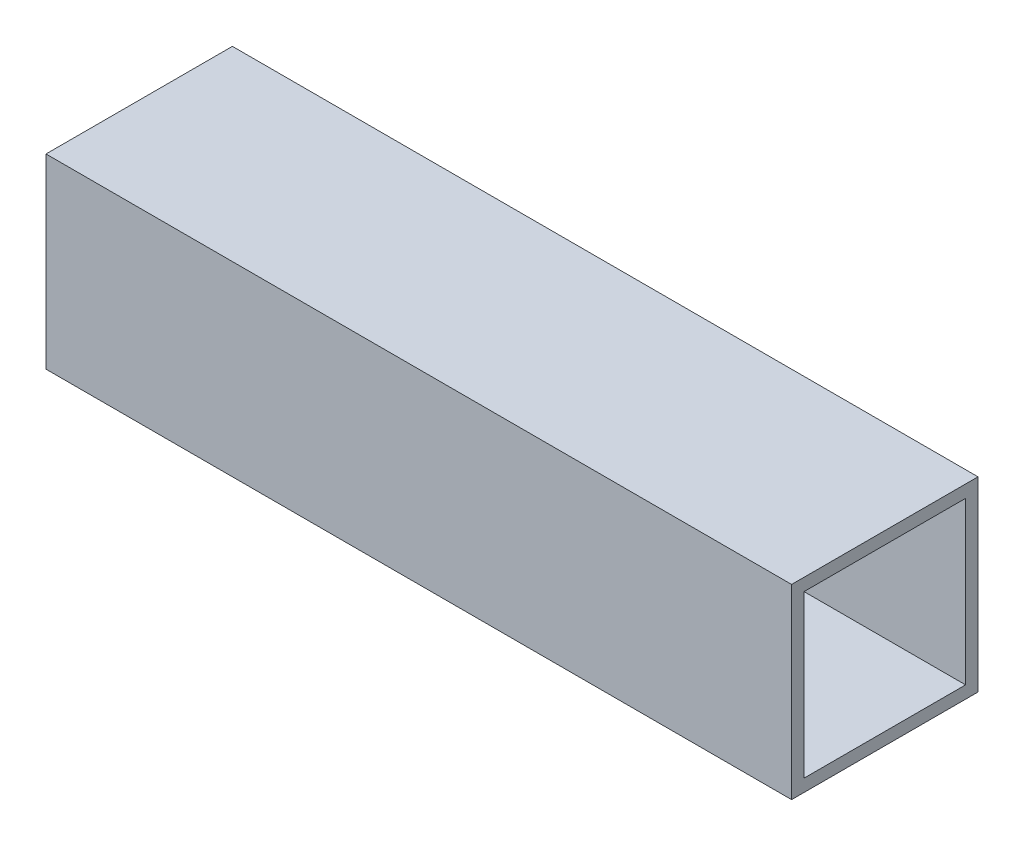
ISO-10303-21;
HEADER;
FILE_DESCRIPTION(('STEP AP214'),'2;1');
FILE_NAME('part.step','',(''),(''),'','','');
FILE_SCHEMA(('AUTOMOTIVE_DESIGN { 1 0 10303 214 1 1 1 1 }'));
ENDSEC;
DATA;
#1=APPLICATION_CONTEXT('core data for automotive mechanical design processes');
#2=APPLICATION_PROTOCOL_DEFINITION('international standard','automotive_design',2000,#1);
#3=PRODUCT_CONTEXT('',#1,'mechanical');
#4=PRODUCT('Part','Part','',(#3));
#5=PRODUCT_RELATED_PRODUCT_CATEGORY('part','',(#4));
#6=PRODUCT_DEFINITION_FORMATION('','',#4);
#7=PRODUCT_DEFINITION_CONTEXT('part definition',#1,'design');
#8=PRODUCT_DEFINITION('design','',#6,#7);
#9=PRODUCT_DEFINITION_SHAPE('','',#8);
#10=(LENGTH_UNIT() NAMED_UNIT(*) SI_UNIT(.MILLI.,.METRE.));
#11=(NAMED_UNIT(*) PLANE_ANGLE_UNIT() SI_UNIT($,.RADIAN.));
#12=(NAMED_UNIT(*) SI_UNIT($,.STERADIAN.) SOLID_ANGLE_UNIT());
#13=UNCERTAINTY_MEASURE_WITH_UNIT(LENGTH_MEASURE(1.E-05),#10,'distance_accuracy_value','');
#14=(GEOMETRIC_REPRESENTATION_CONTEXT(3) GLOBAL_UNCERTAINTY_ASSIGNED_CONTEXT((#13)) GLOBAL_UNIT_ASSIGNED_CONTEXT((#10,
#11,#12)) REPRESENTATION_CONTEXT('',''));
#15=CARTESIAN_POINT('',(0.,0.,0.));
#16=DIRECTION('',(0.,0.,1.));
#17=DIRECTION('',(1.,0.,0.));
#18=AXIS2_PLACEMENT_3D('',#15,#16,#17);
#19=CARTESIAN_POINT('',(-60.,-6.49999999999999,-6.50000000000001));
#20=DIRECTION('',(0.,1.,0.));
#21=DIRECTION('',(0.,0.,1.));
#22=AXIS2_PLACEMENT_3D('',#19,#20,#21);
#23=PLANE('',#22);
#24=DIRECTION('',(0.,0.,1.));
#25=VECTOR('',#24,1.);
#26=CARTESIAN_POINT('',(0.,-6.49999999999999,-6.50000000000001));
#27=LINE('',#26,#25);
#28=CARTESIAN_POINT('',(0.,-6.49999999999999,-6.50000000000001));
#29=VERTEX_POINT('',#28);
#30=CARTESIAN_POINT('',(0.,-6.49999999999999,6.49999999999999));
#31=VERTEX_POINT('',#30);
#32=EDGE_CURVE('E157',#29,#31,#27,.T.);
#33=ORIENTED_EDGE('',*,*,#32,.F.);
#34=DIRECTION('',(1.,0.,0.));
#35=VECTOR('',#34,1.);
#36=CARTESIAN_POINT('',(-60.,-6.49999999999999,-6.50000000000001));
#37=LINE('',#36,#35);
#38=CARTESIAN_POINT('',(-60.,-6.49999999999999,-6.50000000000001));
#39=VERTEX_POINT('',#38);
#40=EDGE_CURVE('E12',#39,#29,#37,.T.);
#41=ORIENTED_EDGE('',*,*,#40,.F.);
#42=DIRECTION('',(0.,0.,1.));
#43=VECTOR('',#42,1.);
#44=CARTESIAN_POINT('',(-60.,-6.49999999999999,-6.50000000000001));
#45=LINE('',#44,#43);
#46=CARTESIAN_POINT('',(-60.,-6.49999999999999,6.49999999999999));
#47=VERTEX_POINT('',#46);
#48=EDGE_CURVE('E139',#39,#47,#45,.T.);
#49=ORIENTED_EDGE('',*,*,#48,.T.);
#50=DIRECTION('',(1.,0.,0.));
#51=VECTOR('',#50,1.);
#52=CARTESIAN_POINT('',(-60.,-6.49999999999999,6.49999999999999));
#53=LINE('',#52,#51);
#54=EDGE_CURVE('E70',#47,#31,#53,.T.);
#55=ORIENTED_EDGE('',*,*,#54,.T.);
#56=EDGE_LOOP('',(#33,#41,#49,#55));
#57=FACE_BOUND('',#56,.T.);
#58=ADVANCED_FACE('F51',(#57),#23,.T.);
#59=CARTESIAN_POINT('',(-60.,6.50000000000001,-6.50000000000001));
#60=DIRECTION('',(0.,0.,1.));
#61=DIRECTION('',(1.,0.,0.));
#62=AXIS2_PLACEMENT_3D('',#59,#60,#61);
#63=PLANE('',#62);
#64=DIRECTION('',(0.,-1.,0.));
#65=VECTOR('',#64,1.);
#66=CARTESIAN_POINT('',(0.,6.50000000000001,-6.50000000000001));
#67=LINE('',#66,#65);
#68=CARTESIAN_POINT('',(0.,6.50000000000001,-6.50000000000001));
#69=VERTEX_POINT('',#68);
#70=EDGE_CURVE('E128',#69,#29,#67,.T.);
#71=ORIENTED_EDGE('',*,*,#70,.F.);
#72=DIRECTION('',(1.,0.,0.));
#73=VECTOR('',#72,1.);
#74=CARTESIAN_POINT('',(-60.,6.50000000000001,-6.50000000000001));
#75=LINE('',#74,#73);
#76=CARTESIAN_POINT('',(-60.,6.50000000000001,-6.50000000000001));
#77=VERTEX_POINT('',#76);
#78=EDGE_CURVE('E61',#77,#69,#75,.T.);
#79=ORIENTED_EDGE('',*,*,#78,.F.);
#80=DIRECTION('',(0.,-1.,0.));
#81=VECTOR('',#80,1.);
#82=CARTESIAN_POINT('',(-60.,6.50000000000001,-6.50000000000001));
#83=LINE('',#82,#81);
#84=EDGE_CURVE('E126',#77,#39,#83,.T.);
#85=ORIENTED_EDGE('',*,*,#84,.T.);
#86=ORIENTED_EDGE('',*,*,#40,.T.);
#87=EDGE_LOOP('',(#71,#79,#85,#86));
#88=FACE_BOUND('',#87,.T.);
#89=ADVANCED_FACE('F125',(#88),#63,.T.);
#90=CARTESIAN_POINT('',(-60.,6.50000000000001,-6.50000000000001));
#91=DIRECTION('',(0.,-1.,0.));
#92=DIRECTION('',(0.,0.,-1.));
#93=AXIS2_PLACEMENT_3D('',#90,#91,#92);
#94=PLANE('',#93);
#95=DIRECTION('',(0.,0.,-1.));
#96=VECTOR('',#95,1.);
#97=CARTESIAN_POINT('',(0.,6.50000000000001,-6.50000000000001));
#98=LINE('',#97,#96);
#99=CARTESIAN_POINT('',(0.,6.50000000000001,6.49999999999999));
#100=VERTEX_POINT('',#99);
#101=EDGE_CURVE('E160',#100,#69,#98,.T.);
#102=ORIENTED_EDGE('',*,*,#101,.F.);
#103=DIRECTION('',(1.,0.,0.));
#104=VECTOR('',#103,1.);
#105=CARTESIAN_POINT('',(-60.,6.50000000000001,6.49999999999999));
#106=LINE('',#105,#104);
#107=CARTESIAN_POINT('',(-60.,6.50000000000001,6.49999999999999));
#108=VERTEX_POINT('',#107);
#109=EDGE_CURVE('E95',#108,#100,#106,.T.);
#110=ORIENTED_EDGE('',*,*,#109,.F.);
#111=DIRECTION('',(0.,0.,-1.));
#112=VECTOR('',#111,1.);
#113=CARTESIAN_POINT('',(-60.,6.50000000000001,-6.50000000000001));
#114=LINE('',#113,#112);
#115=EDGE_CURVE('E138',#108,#77,#114,.T.);
#116=ORIENTED_EDGE('',*,*,#115,.T.);
#117=ORIENTED_EDGE('',*,*,#78,.T.);
#118=EDGE_LOOP('',(#102,#110,#116,#117));
#119=FACE_BOUND('',#118,.T.);
#120=ADVANCED_FACE('F141',(#119),#94,.T.);
#121=CARTESIAN_POINT('',(-60.,-7.49999999999999,-7.50000000000001));
#122=DIRECTION('',(0.,1.,0.));
#123=DIRECTION('',(0.,0.,1.));
#124=AXIS2_PLACEMENT_3D('',#121,#122,#123);
#125=PLANE('',#124);
#126=DIRECTION('',(0.,0.,1.));
#127=VECTOR('',#126,1.);
#128=CARTESIAN_POINT('',(0.,-7.49999999999999,-7.50000000000001));
#129=LINE('',#128,#127);
#130=CARTESIAN_POINT('',(0.,-7.49999999999999,-7.50000000000001));
#131=VERTEX_POINT('',#130);
#132=CARTESIAN_POINT('',(0.,-7.49999999999999,7.49999999999999));
#133=VERTEX_POINT('',#132);
#134=EDGE_CURVE('E148',#131,#133,#129,.T.);
#135=ORIENTED_EDGE('',*,*,#134,.T.);
#136=DIRECTION('',(1.,0.,0.));
#137=VECTOR('',#136,1.);
#138=CARTESIAN_POINT('',(-60.,-7.49999999999999,7.49999999999999));
#139=LINE('',#138,#137);
#140=CARTESIAN_POINT('',(-60.,-7.49999999999999,7.49999999999999));
#141=VERTEX_POINT('',#140);
#142=EDGE_CURVE('E55',#141,#133,#139,.T.);
#143=ORIENTED_EDGE('',*,*,#142,.F.);
#144=DIRECTION('',(0.,0.,1.));
#145=VECTOR('',#144,1.);
#146=CARTESIAN_POINT('',(-60.,-7.49999999999999,-7.50000000000001));
#147=LINE('',#146,#145);
#148=CARTESIAN_POINT('',(-60.,-7.49999999999999,-7.50000000000001));
#149=VERTEX_POINT('',#148);
#150=EDGE_CURVE('E165',#149,#141,#147,.T.);
#151=ORIENTED_EDGE('',*,*,#150,.F.);
#152=DIRECTION('',(1.,0.,0.));
#153=VECTOR('',#152,1.);
#154=CARTESIAN_POINT('',(-60.,-7.49999999999999,-7.50000000000001));
#155=LINE('',#154,#153);
#156=EDGE_CURVE('E144',#149,#131,#155,.T.);
#157=ORIENTED_EDGE('',*,*,#156,.T.);
#158=EDGE_LOOP('',(#135,#143,#151,#157));
#159=FACE_BOUND('',#158,.T.);
#160=ADVANCED_FACE('F53',(#159),#125,.F.);
#161=CARTESIAN_POINT('',(-60.,7.50000000000001,7.49999999999999));
#162=DIRECTION('',(0.,0.,-1.));
#163=DIRECTION('',(-1.,0.,0.));
#164=AXIS2_PLACEMENT_3D('',#161,#162,#163);
#165=PLANE('',#164);
#166=DIRECTION('',(0.,1.,0.));
#167=VECTOR('',#166,1.);
#168=CARTESIAN_POINT('',(0.,7.50000000000001,7.49999999999999));
#169=LINE('',#168,#167);
#170=CARTESIAN_POINT('',(0.,7.50000000000001,7.49999999999999));
#171=VERTEX_POINT('',#170);
#172=EDGE_CURVE('E151',#133,#171,#169,.T.);
#173=ORIENTED_EDGE('',*,*,#172,.T.);
#174=DIRECTION('',(1.,0.,0.));
#175=VECTOR('',#174,1.);
#176=CARTESIAN_POINT('',(-60.,7.50000000000001,7.49999999999999));
#177=LINE('',#176,#175);
#178=CARTESIAN_POINT('',(-60.,7.50000000000001,7.49999999999999));
#179=VERTEX_POINT('',#178);
#180=EDGE_CURVE('E172',#179,#171,#177,.T.);
#181=ORIENTED_EDGE('',*,*,#180,.F.);
#182=DIRECTION('',(0.,1.,0.));
#183=VECTOR('',#182,1.);
#184=CARTESIAN_POINT('',(-60.,7.50000000000001,7.49999999999999));
#185=LINE('',#184,#183);
#186=EDGE_CURVE('E108',#141,#179,#185,.T.);
#187=ORIENTED_EDGE('',*,*,#186,.F.);
#188=ORIENTED_EDGE('',*,*,#142,.T.);
#189=EDGE_LOOP('',(#173,#181,#187,#188));
#190=FACE_BOUND('',#189,.T.);
#191=ADVANCED_FACE('F178',(#190),#165,.F.);
#192=CARTESIAN_POINT('',(-60.,7.49999999999999,-7.50000000000001));
#193=DIRECTION('',(0.,-1.,0.));
#194=DIRECTION('',(0.,0.,-1.));
#195=AXIS2_PLACEMENT_3D('',#192,#193,#194);
#196=PLANE('',#195);
#197=DIRECTION('',(0.,0.,-1.));
#198=VECTOR('',#197,1.);
#199=CARTESIAN_POINT('',(0.,7.49999999999999,-7.50000000000001));
#200=LINE('',#199,#198);
#201=CARTESIAN_POINT('',(0.,7.49999999999999,-7.50000000000001));
#202=VERTEX_POINT('',#201);
#203=EDGE_CURVE('E153',#171,#202,#200,.T.);
#204=ORIENTED_EDGE('',*,*,#203,.T.);
#205=DIRECTION('',(1.,0.,0.));
#206=VECTOR('',#205,1.);
#207=CARTESIAN_POINT('',(-60.,7.49999999999999,-7.50000000000001));
#208=LINE('',#207,#206);
#209=CARTESIAN_POINT('',(-60.,7.49999999999999,-7.50000000000001));
#210=VERTEX_POINT('',#209);
#211=EDGE_CURVE('E170',#210,#202,#208,.T.);
#212=ORIENTED_EDGE('',*,*,#211,.F.);
#213=DIRECTION('',(0.,0.,-1.));
#214=VECTOR('',#213,1.);
#215=CARTESIAN_POINT('',(-60.,7.49999999999999,-7.50000000000001));
#216=LINE('',#215,#214);
#217=EDGE_CURVE('E194',#179,#210,#216,.T.);
#218=ORIENTED_EDGE('',*,*,#217,.F.);
#219=ORIENTED_EDGE('',*,*,#180,.T.);
#220=EDGE_LOOP('',(#204,#212,#218,#219));
#221=FACE_BOUND('',#220,.T.);
#222=ADVANCED_FACE('F188',(#221),#196,.F.);
#223=CARTESIAN_POINT('',(-60.,7.49999999999999,-7.50000000000001));
#224=DIRECTION('',(0.,0.,1.));
#225=DIRECTION('',(1.,0.,0.));
#226=AXIS2_PLACEMENT_3D('',#223,#224,#225);
#227=PLANE('',#226);
#228=DIRECTION('',(0.,-1.,0.));
#229=VECTOR('',#228,1.);
#230=CARTESIAN_POINT('',(0.,7.49999999999999,-7.50000000000001));
#231=LINE('',#230,#229);
#232=EDGE_CURVE('E155',#202,#131,#231,.T.);
#233=ORIENTED_EDGE('',*,*,#232,.T.);
#234=ORIENTED_EDGE('',*,*,#156,.F.);
#235=DIRECTION('',(0.,-1.,0.));
#236=VECTOR('',#235,1.);
#237=CARTESIAN_POINT('',(-60.,7.49999999999999,-7.50000000000001));
#238=LINE('',#237,#236);
#239=EDGE_CURVE('E192',#210,#149,#238,.T.);
#240=ORIENTED_EDGE('',*,*,#239,.F.);
#241=ORIENTED_EDGE('',*,*,#211,.T.);
#242=EDGE_LOOP('',(#233,#234,#240,#241));
#243=FACE_BOUND('',#242,.T.);
#244=ADVANCED_FACE('F191',(#243),#227,.F.);
#245=CARTESIAN_POINT('',(-60.,6.50000000000001,6.49999999999999));
#246=DIRECTION('',(0.,0.,-1.));
#247=DIRECTION('',(-1.,0.,0.));
#248=AXIS2_PLACEMENT_3D('',#245,#246,#247);
#249=PLANE('',#248);
#250=DIRECTION('',(0.,1.,0.));
#251=VECTOR('',#250,1.);
#252=CARTESIAN_POINT('',(0.,6.50000000000001,6.49999999999999));
#253=LINE('',#252,#251);
#254=EDGE_CURVE('E162',#31,#100,#253,.T.);
#255=ORIENTED_EDGE('',*,*,#254,.F.);
#256=ORIENTED_EDGE('',*,*,#54,.F.);
#257=DIRECTION('',(0.,1.,0.));
#258=VECTOR('',#257,1.);
#259=CARTESIAN_POINT('',(-60.,6.50000000000001,6.49999999999999));
#260=LINE('',#259,#258);
#261=EDGE_CURVE('E142',#47,#108,#260,.T.);
#262=ORIENTED_EDGE('',*,*,#261,.T.);
#263=ORIENTED_EDGE('',*,*,#109,.T.);
#264=EDGE_LOOP('',(#255,#256,#262,#263));
#265=FACE_BOUND('',#264,.T.);
#266=ADVANCED_FACE('F200',(#265),#249,.T.);
#267=CARTESIAN_POINT('',(-60.,0.,0.));
#268=DIRECTION('',(1.,0.,0.));
#269=DIRECTION('',(0.,0.,-1.));
#270=AXIS2_PLACEMENT_3D('',#267,#268,#269);
#271=PLANE('',#270);
#272=ORIENTED_EDGE('',*,*,#150,.T.);
#273=ORIENTED_EDGE('',*,*,#186,.T.);
#274=ORIENTED_EDGE('',*,*,#217,.T.);
#275=ORIENTED_EDGE('',*,*,#239,.T.);
#276=EDGE_LOOP('',(#272,#273,#274,#275));
#277=FACE_BOUND('',#276,.T.);
#278=ORIENTED_EDGE('',*,*,#48,.F.);
#279=ORIENTED_EDGE('',*,*,#84,.F.);
#280=ORIENTED_EDGE('',*,*,#115,.F.);
#281=ORIENTED_EDGE('',*,*,#261,.F.);
#282=EDGE_LOOP('',(#278,#279,#280,#281));
#283=FACE_BOUND('',#282,.T.);
#284=ADVANCED_FACE('F136',(#277,#283),#271,.F.);
#285=CARTESIAN_POINT('',(0.,0.,0.));
#286=DIRECTION('',(1.,0.,0.));
#287=DIRECTION('',(0.,0.,-1.));
#288=AXIS2_PLACEMENT_3D('',#285,#286,#287);
#289=PLANE('',#288);
#290=ORIENTED_EDGE('',*,*,#134,.F.);
#291=ORIENTED_EDGE('',*,*,#232,.F.);
#292=ORIENTED_EDGE('',*,*,#203,.F.);
#293=ORIENTED_EDGE('',*,*,#172,.F.);
#294=EDGE_LOOP('',(#290,#291,#292,#293));
#295=FACE_BOUND('',#294,.T.);
#296=ORIENTED_EDGE('',*,*,#32,.T.);
#297=ORIENTED_EDGE('',*,*,#254,.T.);
#298=ORIENTED_EDGE('',*,*,#101,.T.);
#299=ORIENTED_EDGE('',*,*,#70,.T.);
#300=EDGE_LOOP('',(#296,#297,#298,#299));
#301=FACE_BOUND('',#300,.T.);
#302=ADVANCED_FACE('F185',(#295,#301),#289,.T.);
#303=CLOSED_SHELL('',(#58,#89,#120,#160,#191,#222,#244,#266,#284,#302));
#304=MANIFOLD_SOLID_BREP('B2',#303);
#305=ADVANCED_BREP_SHAPE_REPRESENTATION('',(#18,#304),#14);
#306=SHAPE_DEFINITION_REPRESENTATION(#9,#305);
ENDSEC;
END-ISO-10303-21;
